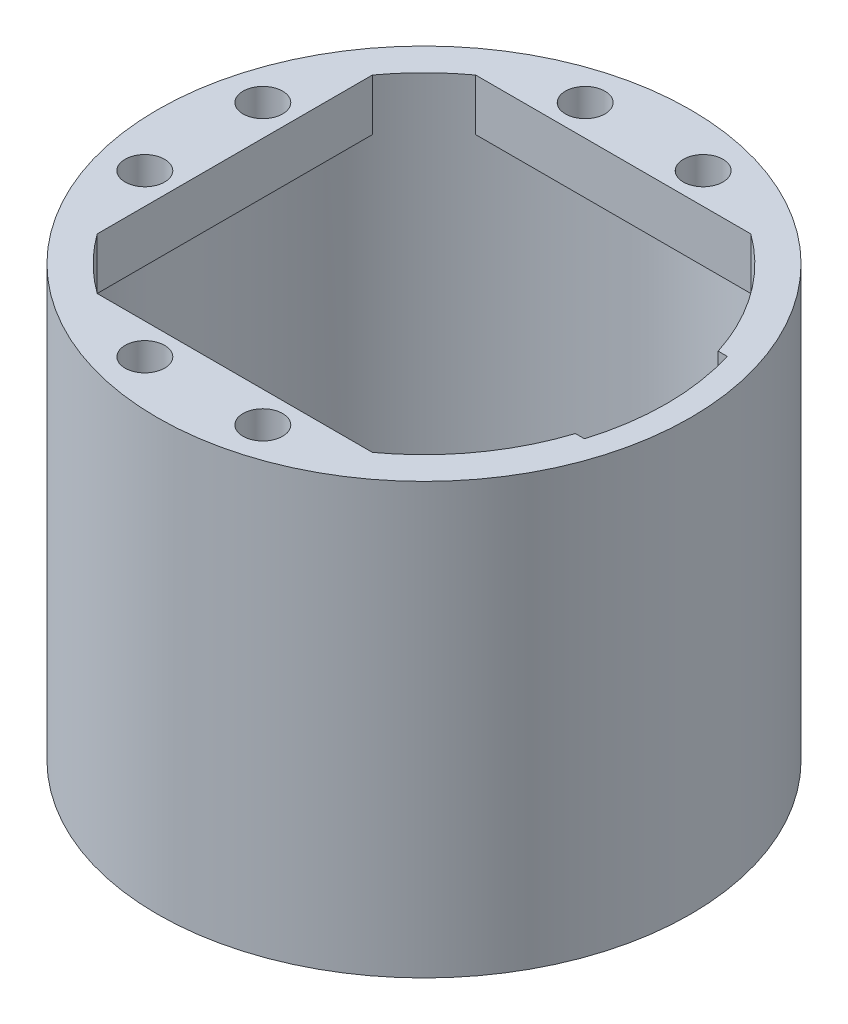
ISO-10303-21;
HEADER;
FILE_DESCRIPTION(('STEP AP214'),'2;1');
FILE_NAME('part.step','',(''),(''),'','','');
FILE_SCHEMA(('AUTOMOTIVE_DESIGN { 1 0 10303 214 1 1 1 1 }'));
ENDSEC;
DATA;
#1=APPLICATION_CONTEXT('core data for automotive mechanical design processes');
#2=APPLICATION_PROTOCOL_DEFINITION('international standard','automotive_design',2000,#1);
#3=PRODUCT_CONTEXT('',#1,'mechanical');
#4=PRODUCT('Part','Part','',(#3));
#5=PRODUCT_RELATED_PRODUCT_CATEGORY('part','',(#4));
#6=PRODUCT_DEFINITION_FORMATION('','',#4);
#7=PRODUCT_DEFINITION_CONTEXT('part definition',#1,'design');
#8=PRODUCT_DEFINITION('design','',#6,#7);
#9=PRODUCT_DEFINITION_SHAPE('','',#8);
#10=(LENGTH_UNIT() NAMED_UNIT(*) SI_UNIT(.MILLI.,.METRE.));
#11=(NAMED_UNIT(*) PLANE_ANGLE_UNIT() SI_UNIT($,.RADIAN.));
#12=(NAMED_UNIT(*) SI_UNIT($,.STERADIAN.) SOLID_ANGLE_UNIT());
#13=UNCERTAINTY_MEASURE_WITH_UNIT(LENGTH_MEASURE(1.E-05),#10,'distance_accuracy_value','');
#14=(GEOMETRIC_REPRESENTATION_CONTEXT(3) GLOBAL_UNCERTAINTY_ASSIGNED_CONTEXT((#13)) GLOBAL_UNIT_ASSIGNED_CONTEXT((#10,
#11,#12)) REPRESENTATION_CONTEXT('',''));
#15=CARTESIAN_POINT('',(0.,0.,0.));
#16=DIRECTION('',(0.,0.,1.));
#17=DIRECTION('',(1.,0.,0.));
#18=AXIS2_PLACEMENT_3D('',#15,#16,#17);
#19=CARTESIAN_POINT('',(0.,-50.,0.));
#20=DIRECTION('',(0.,1.,0.));
#21=DIRECTION('',(0.,0.,1.));
#22=AXIS2_PLACEMENT_3D('',#19,#20,#21);
#23=CYLINDRICAL_SURFACE('',#22,31.);
#24=CARTESIAN_POINT('',(0.,-50.,0.));
#25=DIRECTION('',(0.,1.,0.));
#26=DIRECTION('',(0.,0.,1.));
#27=AXIS2_PLACEMENT_3D('',#24,#25,#26);
#28=CIRCLE('',#27,31.);
#29=CARTESIAN_POINT('',(0.,-50.,31.));
#30=VERTEX_POINT('',#29);
#31=EDGE_CURVE('E11',#30,#30,#28,.T.);
#32=ORIENTED_EDGE('',*,*,#31,.T.);
#33=EDGE_LOOP('',(#32));
#34=FACE_BOUND('',#33,.T.);
#35=CARTESIAN_POINT('',(0.,0.,0.));
#36=DIRECTION('',(0.,1.,0.));
#37=DIRECTION('',(0.,0.,1.));
#38=AXIS2_PLACEMENT_3D('',#35,#36,#37);
#39=CIRCLE('',#38,31.);
#40=CARTESIAN_POINT('',(0.,0.,31.));
#41=VERTEX_POINT('',#40);
#42=EDGE_CURVE('E42',#41,#41,#39,.T.);
#43=ORIENTED_EDGE('',*,*,#42,.F.);
#44=EDGE_LOOP('',(#43));
#45=FACE_BOUND('',#44,.T.);
#46=ADVANCED_FACE('F39',(#34,#45),#23,.T.);
#47=CARTESIAN_POINT('',(0.,-50.,0.));
#48=DIRECTION('',(0.,1.,0.));
#49=DIRECTION('',(0.,0.,1.));
#50=AXIS2_PLACEMENT_3D('',#47,#48,#49);
#51=PLANE('',#50);
#52=DIRECTION('',(-1.,0.,0.));
#53=VECTOR('',#52,1.);
#54=CARTESIAN_POINT('',(25.9027025617019,-50.,-8.3));
#55=LINE('',#54,#53);
#56=CARTESIAN_POINT('',(26.9508812471877,-50.,-8.3));
#57=VERTEX_POINT('',#56);
#58=CARTESIAN_POINT('',(25.9027025617019,-50.,-8.3));
#59=VERTEX_POINT('',#58);
#60=EDGE_CURVE('E179',#57,#59,#55,.T.);
#61=ORIENTED_EDGE('',*,*,#60,.T.);
#62=CARTESIAN_POINT('',(0.,-50.,0.));
#63=DIRECTION('',(0.,1.,0.));
#64=DIRECTION('',(0.,0.,1.));
#65=AXIS2_PLACEMENT_3D('',#62,#63,#64);
#66=CIRCLE('',#65,27.2);
#67=CARTESIAN_POINT('',(25.9027025617019,-50.,8.3));
#68=VERTEX_POINT('',#67);
#69=EDGE_CURVE('E169',#59,#68,#66,.T.);
#70=ORIENTED_EDGE('',*,*,#69,.T.);
#71=DIRECTION('',(1.,0.,0.));
#72=VECTOR('',#71,1.);
#73=CARTESIAN_POINT('',(25.9027025617019,-50.,8.3));
#74=LINE('',#73,#72);
#75=CARTESIAN_POINT('',(26.9508812471877,-50.,8.3));
#76=VERTEX_POINT('',#75);
#77=EDGE_CURVE('E172',#68,#76,#74,.T.);
#78=ORIENTED_EDGE('',*,*,#77,.T.);
#79=CARTESIAN_POINT('',(0.,-50.,0.));
#80=DIRECTION('',(0.,1.,0.));
#81=DIRECTION('',(0.,0.,1.));
#82=AXIS2_PLACEMENT_3D('',#79,#80,#81);
#83=CIRCLE('',#82,28.2000000000002);
#84=EDGE_CURVE('E176',#76,#57,#83,.T.);
#85=ORIENTED_EDGE('',*,*,#84,.T.);
#86=EDGE_LOOP('',(#61,#70,#78,#85));
#87=FACE_BOUND('',#86,.T.);
#88=ORIENTED_EDGE('',*,*,#31,.F.);
#89=EDGE_LOOP('',(#88));
#90=FACE_BOUND('',#89,.T.);
#91=ADVANCED_FACE('F203',(#87,#90),#51,.F.);
#92=CARTESIAN_POINT('',(0.,0.,0.));
#93=DIRECTION('',(0.,1.,0.));
#94=DIRECTION('',(0.,0.,1.));
#95=AXIS2_PLACEMENT_3D('',#92,#93,#94);
#96=PLANE('',#95);
#97=CARTESIAN_POINT('',(-6.85870469521654,0.,25.5970343966603));
#98=DIRECTION('',(0.,1.,0.));
#99=DIRECTION('',(0.,0.,1.));
#100=AXIS2_PLACEMENT_3D('',#97,#98,#99);
#101=CIRCLE('',#100,2.3);
#102=CARTESIAN_POINT('',(-6.85870469521654,0.,27.8970343966603));
#103=VERTEX_POINT('',#102);
#104=EDGE_CURVE('E450',#103,#103,#101,.T.);
#105=ORIENTED_EDGE('',*,*,#104,.F.);
#106=EDGE_LOOP('',(#105));
#107=FACE_BOUND('',#106,.T.);
#108=CARTESIAN_POINT('',(-6.85870469521667,0.,-25.5970343966595));
#109=DIRECTION('',(0.,1.,0.));
#110=DIRECTION('',(0.,0.,1.));
#111=AXIS2_PLACEMENT_3D('',#108,#109,#110);
#112=CIRCLE('',#111,2.29999999999936);
#113=CARTESIAN_POINT('',(-6.85870469521667,0.,-23.2970343966601));
#114=VERTEX_POINT('',#113);
#115=EDGE_CURVE('E474',#114,#114,#112,.T.);
#116=ORIENTED_EDGE('',*,*,#115,.F.);
#117=EDGE_LOOP('',(#116));
#118=FACE_BOUND('',#117,.T.);
#119=CARTESIAN_POINT('',(6.85870469521636,0.,-25.5970343966604));
#120=DIRECTION('',(0.,1.,0.));
#121=DIRECTION('',(0.,0.,1.));
#122=AXIS2_PLACEMENT_3D('',#119,#120,#121);
#123=CIRCLE('',#122,2.3);
#124=CARTESIAN_POINT('',(6.85870469521636,0.,-23.2970343966604));
#125=VERTEX_POINT('',#124);
#126=EDGE_CURVE('E468',#125,#125,#123,.T.);
#127=ORIENTED_EDGE('',*,*,#126,.F.);
#128=EDGE_LOOP('',(#127));
#129=FACE_BOUND('',#128,.T.);
#130=CARTESIAN_POINT('',(-25.5970343966595,0.,6.85870469521676));
#131=DIRECTION('',(0.,1.,0.));
#132=DIRECTION('',(0.,0.,1.));
#133=AXIS2_PLACEMENT_3D('',#130,#131,#132);
#134=CIRCLE('',#133,2.29999999999936);
#135=CARTESIAN_POINT('',(-25.5970343966595,0.,9.15870469521612));
#136=VERTEX_POINT('',#135);
#137=EDGE_CURVE('E461',#136,#136,#134,.T.);
#138=ORIENTED_EDGE('',*,*,#137,.F.);
#139=EDGE_LOOP('',(#138));
#140=FACE_BOUND('',#139,.T.);
#141=CARTESIAN_POINT('',(6.85870469521649,0.,25.5970343966596));
#142=DIRECTION('',(0.,1.,0.));
#143=DIRECTION('',(0.,0.,1.));
#144=AXIS2_PLACEMENT_3D('',#141,#142,#143);
#145=CIRCLE('',#144,2.29999999999936);
#146=CARTESIAN_POINT('',(6.85870469521649,0.,27.8970343966589));
#147=VERTEX_POINT('',#146);
#148=EDGE_CURVE('E451',#147,#147,#145,.T.);
#149=ORIENTED_EDGE('',*,*,#148,.F.);
#150=EDGE_LOOP('',(#149));
#151=FACE_BOUND('',#150,.T.);
#152=CARTESIAN_POINT('',(-25.5970343966604,0.,-6.85870469521627));
#153=DIRECTION('',(0.,1.,0.));
#154=DIRECTION('',(0.,0.,1.));
#155=AXIS2_PLACEMENT_3D('',#152,#153,#154);
#156=CIRCLE('',#155,2.3);
#157=CARTESIAN_POINT('',(-25.5970343966604,0.,-4.55870469521628));
#158=VERTEX_POINT('',#157);
#159=EDGE_CURVE('E464',#158,#158,#156,.T.);
#160=ORIENTED_EDGE('',*,*,#159,.F.);
#161=EDGE_LOOP('',(#160));
#162=FACE_BOUND('',#161,.T.);
#163=CARTESIAN_POINT('',(0.,0.,0.));
#164=DIRECTION('',(0.,1.,0.));
#165=DIRECTION('',(0.,0.,1.));
#166=AXIS2_PLACEMENT_3D('',#163,#164,#165);
#167=CIRCLE('',#166,27.2);
#168=CARTESIAN_POINT('',(25.9027025617019,0.,-8.3));
#169=VERTEX_POINT('',#168);
#170=CARTESIAN_POINT('',(15.9949992185199,0.,-21.9999999999897));
#171=VERTEX_POINT('',#170);
#172=EDGE_CURVE('E126',#169,#171,#167,.T.);
#173=ORIENTED_EDGE('',*,*,#172,.F.);
#174=DIRECTION('',(-1.,0.,0.));
#175=VECTOR('',#174,1.);
#176=CARTESIAN_POINT('',(25.9027025617019,0.,-8.3));
#177=LINE('',#176,#175);
#178=CARTESIAN_POINT('',(26.9508812471877,0.,-8.3));
#179=VERTEX_POINT('',#178);
#180=EDGE_CURVE('E173',#179,#169,#177,.T.);
#181=ORIENTED_EDGE('',*,*,#180,.F.);
#182=CARTESIAN_POINT('',(0.,0.,0.));
#183=DIRECTION('',(0.,1.,0.));
#184=DIRECTION('',(0.,0.,1.));
#185=AXIS2_PLACEMENT_3D('',#182,#183,#184);
#186=CIRCLE('',#185,28.2000000000002);
#187=CARTESIAN_POINT('',(26.9508812471877,0.,8.3));
#188=VERTEX_POINT('',#187);
#189=EDGE_CURVE('E185',#188,#179,#186,.T.);
#190=ORIENTED_EDGE('',*,*,#189,.F.);
#191=DIRECTION('',(1.,0.,0.));
#192=VECTOR('',#191,1.);
#193=CARTESIAN_POINT('',(25.9027025617019,0.,8.3));
#194=LINE('',#193,#192);
#195=CARTESIAN_POINT('',(25.9027025617019,0.,8.3));
#196=VERTEX_POINT('',#195);
#197=EDGE_CURVE('E122',#196,#188,#194,.T.);
#198=ORIENTED_EDGE('',*,*,#197,.F.);
#199=CARTESIAN_POINT('',(15.9949992185198,0.,21.9999999999898));
#200=VERTEX_POINT('',#199);
#201=EDGE_CURVE('E114',#200,#196,#167,.T.);
#202=ORIENTED_EDGE('',*,*,#201,.F.);
#203=DIRECTION('',(-1.,0.,0.));
#204=VECTOR('',#203,1.);
#205=CARTESIAN_POINT('',(15.9949992185198,0.,21.9999999999898));
#206=LINE('',#205,#204);
#207=CARTESIAN_POINT('',(-15.9949992185201,0.,21.9999999999896));
#208=VERTEX_POINT('',#207);
#209=EDGE_CURVE('E119',#200,#208,#206,.T.);
#210=ORIENTED_EDGE('',*,*,#209,.T.);
#211=CARTESIAN_POINT('',(-21.9999999999899,0.,15.9949992185197));
#212=VERTEX_POINT('',#211);
#213=EDGE_CURVE('E124',#212,#208,#167,.T.);
#214=ORIENTED_EDGE('',*,*,#213,.F.);
#215=DIRECTION('',(0.,0.,-1.));
#216=VECTOR('',#215,1.);
#217=CARTESIAN_POINT('',(-21.9999999999899,0.,15.9949992185197));
#218=LINE('',#217,#216);
#219=CARTESIAN_POINT('',(-21.9999999999899,0.,-15.9949992185197));
#220=VERTEX_POINT('',#219);
#221=EDGE_CURVE('E150',#212,#220,#218,.T.);
#222=ORIENTED_EDGE('',*,*,#221,.T.);
#223=CARTESIAN_POINT('',(-15.9949992185199,0.,-21.9999999999897));
#224=VERTEX_POINT('',#223);
#225=EDGE_CURVE('E183',#224,#220,#167,.T.);
#226=ORIENTED_EDGE('',*,*,#225,.F.);
#227=DIRECTION('',(1.,0.,0.));
#228=VECTOR('',#227,1.);
#229=CARTESIAN_POINT('',(-15.9949992185199,0.,-21.9999999999897));
#230=LINE('',#229,#228);
#231=EDGE_CURVE('E135',#224,#171,#230,.T.);
#232=ORIENTED_EDGE('',*,*,#231,.T.);
#233=EDGE_LOOP('',(#173,#181,#190,#198,#202,#210,#214,#222,#226,#232));
#234=FACE_BOUND('',#233,.T.);
#235=ORIENTED_EDGE('',*,*,#42,.T.);
#236=EDGE_LOOP('',(#235));
#237=FACE_BOUND('',#236,.T.);
#238=ADVANCED_FACE('F116',(#107,#118,#129,#140,#151,#162,#234,#237),#96,.T.);
#239=CARTESIAN_POINT('',(0.,-50.,0.));
#240=DIRECTION('',(0.,1.,0.));
#241=DIRECTION('',(0.,0.,1.));
#242=AXIS2_PLACEMENT_3D('',#239,#240,#241);
#243=CYLINDRICAL_SURFACE('',#242,27.2);
#244=ORIENTED_EDGE('',*,*,#213,.T.);
#245=DIRECTION('',(0.,1.,0.));
#246=VECTOR('',#245,1.);
#247=CARTESIAN_POINT('',(-15.9949992185201,-6.,21.9999999999896));
#248=LINE('',#247,#246);
#249=CARTESIAN_POINT('',(-15.9949992185201,-6.,21.9999999999896));
#250=VERTEX_POINT('',#249);
#251=EDGE_CURVE('E53',#250,#208,#248,.T.);
#252=ORIENTED_EDGE('',*,*,#251,.F.);
#253=CARTESIAN_POINT('',(0.,-6.,0.));
#254=DIRECTION('',(0.,1.,0.));
#255=DIRECTION('',(0.,0.,1.));
#256=AXIS2_PLACEMENT_3D('',#253,#254,#255);
#257=CIRCLE('',#256,27.2);
#258=CARTESIAN_POINT('',(15.9949992185198,-6.,21.9999999999898));
#259=VERTEX_POINT('',#258);
#260=EDGE_CURVE('E57',#250,#259,#257,.T.);
#261=ORIENTED_EDGE('',*,*,#260,.T.);
#262=DIRECTION('',(0.,1.,0.));
#263=VECTOR('',#262,1.);
#264=CARTESIAN_POINT('',(15.9949992185198,-6.,21.9999999999898));
#265=LINE('',#264,#263);
#266=EDGE_CURVE('E127',#259,#200,#265,.T.);
#267=ORIENTED_EDGE('',*,*,#266,.T.);
#268=ORIENTED_EDGE('',*,*,#201,.T.);
#269=DIRECTION('',(0.,1.,0.));
#270=VECTOR('',#269,1.);
#271=CARTESIAN_POINT('',(25.9027025617019,-50.,8.3));
#272=LINE('',#271,#270);
#273=EDGE_CURVE('E181',#68,#196,#272,.T.);
#274=ORIENTED_EDGE('',*,*,#273,.F.);
#275=ORIENTED_EDGE('',*,*,#69,.F.);
#276=DIRECTION('',(0.,1.,0.));
#277=VECTOR('',#276,1.);
#278=CARTESIAN_POINT('',(25.9027025617019,-50.,-8.3));
#279=LINE('',#278,#277);
#280=EDGE_CURVE('E190',#59,#169,#279,.T.);
#281=ORIENTED_EDGE('',*,*,#280,.T.);
#282=ORIENTED_EDGE('',*,*,#172,.T.);
#283=DIRECTION('',(0.,1.,0.));
#284=VECTOR('',#283,1.);
#285=CARTESIAN_POINT('',(15.9949992185199,-6.,-21.9999999999897));
#286=LINE('',#285,#284);
#287=CARTESIAN_POINT('',(15.9949992185199,-6.,-21.9999999999897));
#288=VERTEX_POINT('',#287);
#289=EDGE_CURVE('E148',#288,#171,#286,.T.);
#290=ORIENTED_EDGE('',*,*,#289,.F.);
#291=CARTESIAN_POINT('',(0.,-6.,0.));
#292=DIRECTION('',(0.,1.,0.));
#293=DIRECTION('',(0.,0.,1.));
#294=AXIS2_PLACEMENT_3D('',#291,#292,#293);
#295=CIRCLE('',#294,27.2);
#296=CARTESIAN_POINT('',(-15.9949992185199,-6.,-21.9999999999897));
#297=VERTEX_POINT('',#296);
#298=EDGE_CURVE('E139',#288,#297,#295,.T.);
#299=ORIENTED_EDGE('',*,*,#298,.T.);
#300=DIRECTION('',(0.,1.,0.));
#301=VECTOR('',#300,1.);
#302=CARTESIAN_POINT('',(-15.9949992185199,-6.,-21.9999999999897));
#303=LINE('',#302,#301);
#304=EDGE_CURVE('E144',#297,#224,#303,.T.);
#305=ORIENTED_EDGE('',*,*,#304,.T.);
#306=ORIENTED_EDGE('',*,*,#225,.T.);
#307=DIRECTION('',(0.,1.,0.));
#308=VECTOR('',#307,1.);
#309=CARTESIAN_POINT('',(-21.9999999999899,-6.,-15.9949992185197));
#310=LINE('',#309,#308);
#311=CARTESIAN_POINT('',(-21.9999999999899,-6.,-15.9949992185197));
#312=VERTEX_POINT('',#311);
#313=EDGE_CURVE('E159',#312,#220,#310,.T.);
#314=ORIENTED_EDGE('',*,*,#313,.F.);
#315=CARTESIAN_POINT('',(0.,-6.,0.));
#316=DIRECTION('',(0.,1.,0.));
#317=DIRECTION('',(0.,0.,1.));
#318=AXIS2_PLACEMENT_3D('',#315,#316,#317);
#319=CIRCLE('',#318,27.2);
#320=CARTESIAN_POINT('',(-21.9999999999898,-6.,15.9949992185197));
#321=VERTEX_POINT('',#320);
#322=EDGE_CURVE('E165',#312,#321,#319,.T.);
#323=ORIENTED_EDGE('',*,*,#322,.T.);
#324=DIRECTION('',(0.,1.,0.));
#325=VECTOR('',#324,1.);
#326=CARTESIAN_POINT('',(-21.9999999999899,-6.,15.9949992185197));
#327=LINE('',#326,#325);
#328=EDGE_CURVE('E155',#321,#212,#327,.T.);
#329=ORIENTED_EDGE('',*,*,#328,.T.);
#330=EDGE_LOOP('',(#244,#252,#261,#267,#268,#274,#275,#281,#282,#290,#299,#305,#306,#314,#323,#329));
#331=FACE_BOUND('',#330,.T.);
#332=ADVANCED_FACE('F128',(#331),#243,.F.);
#333=CARTESIAN_POINT('',(25.9027025617019,-50.,-8.3));
#334=DIRECTION('',(0.,0.,-1.));
#335=DIRECTION('',(-1.,0.,0.));
#336=AXIS2_PLACEMENT_3D('',#333,#334,#335);
#337=PLANE('',#336);
#338=ORIENTED_EDGE('',*,*,#180,.T.);
#339=ORIENTED_EDGE('',*,*,#280,.F.);
#340=ORIENTED_EDGE('',*,*,#60,.F.);
#341=DIRECTION('',(0.,1.,0.));
#342=VECTOR('',#341,1.);
#343=CARTESIAN_POINT('',(26.9508812471877,-50.,-8.3));
#344=LINE('',#343,#342);
#345=EDGE_CURVE('E192',#57,#179,#344,.T.);
#346=ORIENTED_EDGE('',*,*,#345,.T.);
#347=EDGE_LOOP('',(#338,#339,#340,#346));
#348=FACE_BOUND('',#347,.T.);
#349=ADVANCED_FACE('F206',(#348),#337,.F.);
#350=CARTESIAN_POINT('',(0.,-50.,0.));
#351=DIRECTION('',(0.,1.,0.));
#352=DIRECTION('',(0.,0.,1.));
#353=AXIS2_PLACEMENT_3D('',#350,#351,#352);
#354=CYLINDRICAL_SURFACE('',#353,28.2000000000002);
#355=ORIENTED_EDGE('',*,*,#189,.T.);
#356=ORIENTED_EDGE('',*,*,#345,.F.);
#357=ORIENTED_EDGE('',*,*,#84,.F.);
#358=DIRECTION('',(0.,1.,0.));
#359=VECTOR('',#358,1.);
#360=CARTESIAN_POINT('',(26.9508812471877,-50.,8.3));
#361=LINE('',#360,#359);
#362=EDGE_CURVE('E194',#76,#188,#361,.T.);
#363=ORIENTED_EDGE('',*,*,#362,.T.);
#364=EDGE_LOOP('',(#355,#356,#357,#363));
#365=FACE_BOUND('',#364,.T.);
#366=ADVANCED_FACE('F256',(#365),#354,.F.);
#367=CARTESIAN_POINT('',(25.9027025617019,-50.,8.3));
#368=DIRECTION('',(0.,0.,1.));
#369=DIRECTION('',(1.,0.,0.));
#370=AXIS2_PLACEMENT_3D('',#367,#368,#369);
#371=PLANE('',#370);
#372=ORIENTED_EDGE('',*,*,#197,.T.);
#373=ORIENTED_EDGE('',*,*,#362,.F.);
#374=ORIENTED_EDGE('',*,*,#77,.F.);
#375=ORIENTED_EDGE('',*,*,#273,.T.);
#376=EDGE_LOOP('',(#372,#373,#374,#375));
#377=FACE_BOUND('',#376,.T.);
#378=ADVANCED_FACE('F198',(#377),#371,.F.);
#379=CARTESIAN_POINT('',(-21.9999999999899,-6.,15.9949992185197));
#380=DIRECTION('',(1.,0.,0.));
#381=DIRECTION('',(0.,0.,-1.));
#382=AXIS2_PLACEMENT_3D('',#379,#380,#381);
#383=PLANE('',#382);
#384=ORIENTED_EDGE('',*,*,#221,.F.);
#385=ORIENTED_EDGE('',*,*,#328,.F.);
#386=DIRECTION('',(0.,0.,-1.));
#387=VECTOR('',#386,1.);
#388=CARTESIAN_POINT('',(-21.9999999999899,-6.,15.9949992185197));
#389=LINE('',#388,#387);
#390=EDGE_CURVE('E158',#321,#312,#389,.T.);
#391=ORIENTED_EDGE('',*,*,#390,.T.);
#392=ORIENTED_EDGE('',*,*,#313,.T.);
#393=EDGE_LOOP('',(#384,#385,#391,#392));
#394=FACE_BOUND('',#393,.T.);
#395=ADVANCED_FACE('F219',(#394),#383,.T.);
#396=CARTESIAN_POINT('',(0.,-6.,0.));
#397=DIRECTION('',(0.,1.,0.));
#398=DIRECTION('',(0.,0.,1.));
#399=AXIS2_PLACEMENT_3D('',#396,#397,#398);
#400=PLANE('',#399);
#401=ORIENTED_EDGE('',*,*,#322,.F.);
#402=ORIENTED_EDGE('',*,*,#390,.F.);
#403=EDGE_LOOP('',(#401,#402));
#404=FACE_BOUND('',#403,.T.);
#405=ADVANCED_FACE('F223',(#404),#400,.F.);
#406=CARTESIAN_POINT('',(-15.9949992185199,-6.,-21.9999999999897));
#407=DIRECTION('',(0.,0.,1.));
#408=DIRECTION('',(1.,0.,0.));
#409=AXIS2_PLACEMENT_3D('',#406,#407,#408);
#410=PLANE('',#409);
#411=ORIENTED_EDGE('',*,*,#231,.F.);
#412=ORIENTED_EDGE('',*,*,#304,.F.);
#413=DIRECTION('',(1.,0.,0.));
#414=VECTOR('',#413,1.);
#415=CARTESIAN_POINT('',(-15.9949992185199,-6.,-21.9999999999897));
#416=LINE('',#415,#414);
#417=EDGE_CURVE('E147',#297,#288,#416,.T.);
#418=ORIENTED_EDGE('',*,*,#417,.T.);
#419=ORIENTED_EDGE('',*,*,#289,.T.);
#420=EDGE_LOOP('',(#411,#412,#418,#419));
#421=FACE_BOUND('',#420,.T.);
#422=ADVANCED_FACE('F211',(#421),#410,.T.);
#423=CARTESIAN_POINT('',(0.,-6.,0.));
#424=DIRECTION('',(0.,1.,0.));
#425=DIRECTION('',(0.,0.,1.));
#426=AXIS2_PLACEMENT_3D('',#423,#424,#425);
#427=PLANE('',#426);
#428=ORIENTED_EDGE('',*,*,#298,.F.);
#429=ORIENTED_EDGE('',*,*,#417,.F.);
#430=EDGE_LOOP('',(#428,#429));
#431=FACE_BOUND('',#430,.T.);
#432=ADVANCED_FACE('F215',(#431),#427,.F.);
#433=CARTESIAN_POINT('',(15.9949992185198,-6.,21.9999999999898));
#434=DIRECTION('',(0.,0.,-1.));
#435=DIRECTION('',(-1.,0.,0.));
#436=AXIS2_PLACEMENT_3D('',#433,#434,#435);
#437=PLANE('',#436);
#438=ORIENTED_EDGE('',*,*,#209,.F.);
#439=ORIENTED_EDGE('',*,*,#266,.F.);
#440=DIRECTION('',(-1.,0.,0.));
#441=VECTOR('',#440,1.);
#442=CARTESIAN_POINT('',(15.9949992185198,-6.,21.9999999999898));
#443=LINE('',#442,#441);
#444=EDGE_CURVE('E132',#259,#250,#443,.T.);
#445=ORIENTED_EDGE('',*,*,#444,.T.);
#446=ORIENTED_EDGE('',*,*,#251,.T.);
#447=EDGE_LOOP('',(#438,#439,#445,#446));
#448=FACE_BOUND('',#447,.T.);
#449=ADVANCED_FACE('F134',(#448),#437,.T.);
#450=CARTESIAN_POINT('',(0.,-6.,0.));
#451=DIRECTION('',(0.,1.,0.));
#452=DIRECTION('',(0.,0.,1.));
#453=AXIS2_PLACEMENT_3D('',#450,#451,#452);
#454=PLANE('',#453);
#455=ORIENTED_EDGE('',*,*,#260,.F.);
#456=ORIENTED_EDGE('',*,*,#444,.F.);
#457=EDGE_LOOP('',(#455,#456));
#458=FACE_BOUND('',#457,.T.);
#459=ADVANCED_FACE('F317',(#458),#454,.F.);
#460=CARTESIAN_POINT('',(-25.5970343966604,-4.,-6.85870469521627));
#461=DIRECTION('',(0.,1.,0.));
#462=DIRECTION('',(0.,0.,1.));
#463=AXIS2_PLACEMENT_3D('',#460,#461,#462);
#464=CYLINDRICAL_SURFACE('',#463,2.3);
#465=CARTESIAN_POINT('',(-25.5970343966604,-4.,-6.85870469521627));
#466=DIRECTION('',(0.,1.,0.));
#467=DIRECTION('',(0.,0.,1.));
#468=AXIS2_PLACEMENT_3D('',#465,#466,#467);
#469=CIRCLE('',#468,2.3);
#470=CARTESIAN_POINT('',(-25.5970343966604,-4.,-4.55870469521628));
#471=VERTEX_POINT('',#470);
#472=EDGE_CURVE('E162',#471,#471,#469,.T.);
#473=ORIENTED_EDGE('',*,*,#472,.F.);
#474=EDGE_LOOP('',(#473));
#475=FACE_BOUND('',#474,.T.);
#476=ORIENTED_EDGE('',*,*,#159,.T.);
#477=EDGE_LOOP('',(#476));
#478=FACE_BOUND('',#477,.T.);
#479=ADVANCED_FACE('F325',(#475,#478),#464,.F.);
#480=CARTESIAN_POINT('',(-25.5970343966604,-4.,-6.85870469521627));
#481=DIRECTION('',(0.,1.,0.));
#482=DIRECTION('',(0.,0.,1.));
#483=AXIS2_PLACEMENT_3D('',#480,#481,#482);
#484=PLANE('',#483);
#485=ORIENTED_EDGE('',*,*,#472,.T.);
#486=EDGE_LOOP('',(#485));
#487=FACE_BOUND('',#486,.T.);
#488=ADVANCED_FACE('F334',(#487),#484,.T.);
#489=CARTESIAN_POINT('',(6.85870469521649,-4.,25.5970343966596));
#490=DIRECTION('',(0.,1.,0.));
#491=DIRECTION('',(0.,0.,1.));
#492=AXIS2_PLACEMENT_3D('',#489,#490,#491);
#493=CYLINDRICAL_SURFACE('',#492,2.29999999999936);
#494=CARTESIAN_POINT('',(6.85870469521649,-4.,25.5970343966596));
#495=DIRECTION('',(0.,1.,0.));
#496=DIRECTION('',(0.,0.,1.));
#497=AXIS2_PLACEMENT_3D('',#494,#495,#496);
#498=CIRCLE('',#497,2.29999999999936);
#499=CARTESIAN_POINT('',(6.85870469521649,-4.,27.8970343966589));
#500=VERTEX_POINT('',#499);
#501=EDGE_CURVE('E457',#500,#500,#498,.T.);
#502=ORIENTED_EDGE('',*,*,#501,.F.);
#503=EDGE_LOOP('',(#502));
#504=FACE_BOUND('',#503,.T.);
#505=ORIENTED_EDGE('',*,*,#148,.T.);
#506=EDGE_LOOP('',(#505));
#507=FACE_BOUND('',#506,.T.);
#508=ADVANCED_FACE('F344',(#504,#507),#493,.F.);
#509=CARTESIAN_POINT('',(6.85870469521649,-4.,25.5970343966596));
#510=DIRECTION('',(0.,1.,0.));
#511=DIRECTION('',(0.,0.,1.));
#512=AXIS2_PLACEMENT_3D('',#509,#510,#511);
#513=PLANE('',#512);
#514=ORIENTED_EDGE('',*,*,#501,.T.);
#515=EDGE_LOOP('',(#514));
#516=FACE_BOUND('',#515,.T.);
#517=ADVANCED_FACE('F354',(#516),#513,.T.);
#518=CARTESIAN_POINT('',(-25.5970343966595,-4.,6.85870469521676));
#519=DIRECTION('',(0.,1.,0.));
#520=DIRECTION('',(0.,0.,1.));
#521=AXIS2_PLACEMENT_3D('',#518,#519,#520);
#522=CYLINDRICAL_SURFACE('',#521,2.29999999999936);
#523=CARTESIAN_POINT('',(-25.5970343966595,-4.,6.85870469521676));
#524=DIRECTION('',(0.,1.,0.));
#525=DIRECTION('',(0.,0.,1.));
#526=AXIS2_PLACEMENT_3D('',#523,#524,#525);
#527=CIRCLE('',#526,2.29999999999936);
#528=CARTESIAN_POINT('',(-25.5970343966595,-4.,9.15870469521612));
#529=VERTEX_POINT('',#528);
#530=EDGE_CURVE('E465',#529,#529,#527,.T.);
#531=ORIENTED_EDGE('',*,*,#530,.F.);
#532=EDGE_LOOP('',(#531));
#533=FACE_BOUND('',#532,.T.);
#534=ORIENTED_EDGE('',*,*,#137,.T.);
#535=EDGE_LOOP('',(#534));
#536=FACE_BOUND('',#535,.T.);
#537=ADVANCED_FACE('F364',(#533,#536),#522,.F.);
#538=CARTESIAN_POINT('',(-25.5970343966595,-4.,6.85870469521676));
#539=DIRECTION('',(0.,1.,0.));
#540=DIRECTION('',(0.,0.,1.));
#541=AXIS2_PLACEMENT_3D('',#538,#539,#540);
#542=PLANE('',#541);
#543=ORIENTED_EDGE('',*,*,#530,.T.);
#544=EDGE_LOOP('',(#543));
#545=FACE_BOUND('',#544,.T.);
#546=ADVANCED_FACE('F374',(#545),#542,.T.);
#547=CARTESIAN_POINT('',(6.85870469521636,-4.,-25.5970343966604));
#548=DIRECTION('',(0.,1.,0.));
#549=DIRECTION('',(0.,0.,1.));
#550=AXIS2_PLACEMENT_3D('',#547,#548,#549);
#551=CYLINDRICAL_SURFACE('',#550,2.3);
#552=CARTESIAN_POINT('',(6.85870469521636,-4.,-25.5970343966604));
#553=DIRECTION('',(0.,1.,0.));
#554=DIRECTION('',(0.,0.,1.));
#555=AXIS2_PLACEMENT_3D('',#552,#553,#554);
#556=CIRCLE('',#555,2.3);
#557=CARTESIAN_POINT('',(6.85870469521636,-4.,-23.2970343966604));
#558=VERTEX_POINT('',#557);
#559=EDGE_CURVE('E471',#558,#558,#556,.T.);
#560=ORIENTED_EDGE('',*,*,#559,.F.);
#561=EDGE_LOOP('',(#560));
#562=FACE_BOUND('',#561,.T.);
#563=ORIENTED_EDGE('',*,*,#126,.T.);
#564=EDGE_LOOP('',(#563));
#565=FACE_BOUND('',#564,.T.);
#566=ADVANCED_FACE('F384',(#562,#565),#551,.F.);
#567=CARTESIAN_POINT('',(6.85870469521636,-4.,-25.5970343966604));
#568=DIRECTION('',(0.,1.,0.));
#569=DIRECTION('',(0.,0.,1.));
#570=AXIS2_PLACEMENT_3D('',#567,#568,#569);
#571=PLANE('',#570);
#572=ORIENTED_EDGE('',*,*,#559,.T.);
#573=EDGE_LOOP('',(#572));
#574=FACE_BOUND('',#573,.T.);
#575=ADVANCED_FACE('F394',(#574),#571,.T.);
#576=CARTESIAN_POINT('',(-6.85870469521667,-4.,-25.5970343966595));
#577=DIRECTION('',(0.,1.,0.));
#578=DIRECTION('',(0.,0.,1.));
#579=AXIS2_PLACEMENT_3D('',#576,#577,#578);
#580=CYLINDRICAL_SURFACE('',#579,2.29999999999936);
#581=CARTESIAN_POINT('',(-6.85870469521667,-4.,-25.5970343966595));
#582=DIRECTION('',(0.,1.,0.));
#583=DIRECTION('',(0.,0.,1.));
#584=AXIS2_PLACEMENT_3D('',#581,#582,#583);
#585=CIRCLE('',#584,2.29999999999936);
#586=CARTESIAN_POINT('',(-6.85870469521667,-4.,-23.2970343966601));
#587=VERTEX_POINT('',#586);
#588=EDGE_CURVE('E454',#587,#587,#585,.T.);
#589=ORIENTED_EDGE('',*,*,#588,.F.);
#590=EDGE_LOOP('',(#589));
#591=FACE_BOUND('',#590,.T.);
#592=ORIENTED_EDGE('',*,*,#115,.T.);
#593=EDGE_LOOP('',(#592));
#594=FACE_BOUND('',#593,.T.);
#595=ADVANCED_FACE('F404',(#591,#594),#580,.F.);
#596=CARTESIAN_POINT('',(-6.85870469521667,-4.,-25.5970343966595));
#597=DIRECTION('',(0.,1.,0.));
#598=DIRECTION('',(0.,0.,1.));
#599=AXIS2_PLACEMENT_3D('',#596,#597,#598);
#600=PLANE('',#599);
#601=ORIENTED_EDGE('',*,*,#588,.T.);
#602=EDGE_LOOP('',(#601));
#603=FACE_BOUND('',#602,.T.);
#604=ADVANCED_FACE('F414',(#603),#600,.T.);
#605=CARTESIAN_POINT('',(-6.85870469521654,-4.,25.5970343966603));
#606=DIRECTION('',(0.,1.,0.));
#607=DIRECTION('',(0.,0.,1.));
#608=AXIS2_PLACEMENT_3D('',#605,#606,#607);
#609=CYLINDRICAL_SURFACE('',#608,2.3);
#610=CARTESIAN_POINT('',(-6.85870469521654,-4.,25.5970343966603));
#611=DIRECTION('',(0.,1.,0.));
#612=DIRECTION('',(0.,0.,1.));
#613=AXIS2_PLACEMENT_3D('',#610,#611,#612);
#614=CIRCLE('',#613,2.3);
#615=CARTESIAN_POINT('',(-6.85870469521654,-4.,27.8970343966603));
#616=VERTEX_POINT('',#615);
#617=EDGE_CURVE('E449',#616,#616,#614,.T.);
#618=ORIENTED_EDGE('',*,*,#617,.F.);
#619=EDGE_LOOP('',(#618));
#620=FACE_BOUND('',#619,.T.);
#621=ORIENTED_EDGE('',*,*,#104,.T.);
#622=EDGE_LOOP('',(#621));
#623=FACE_BOUND('',#622,.T.);
#624=ADVANCED_FACE('F424',(#620,#623),#609,.F.);
#625=CARTESIAN_POINT('',(-6.85870469521654,-4.,25.5970343966603));
#626=DIRECTION('',(0.,1.,0.));
#627=DIRECTION('',(0.,0.,1.));
#628=AXIS2_PLACEMENT_3D('',#625,#626,#627);
#629=PLANE('',#628);
#630=ORIENTED_EDGE('',*,*,#617,.T.);
#631=EDGE_LOOP('',(#630));
#632=FACE_BOUND('',#631,.T.);
#633=ADVANCED_FACE('F434',(#632),#629,.T.);
#634=CLOSED_SHELL('',(#46,#91,#238,#332,#349,#366,#378,#395,#405,#422,#432,#449,#459,#479,#488,
#508,#517,#537,#546,#566,#575,#595,#604,#624,#633));
#635=MANIFOLD_SOLID_BREP('B2',#634);
#636=ADVANCED_BREP_SHAPE_REPRESENTATION('',(#18,#635),#14);
#637=SHAPE_DEFINITION_REPRESENTATION(#9,#636);
ENDSEC;
END-ISO-10303-21;
